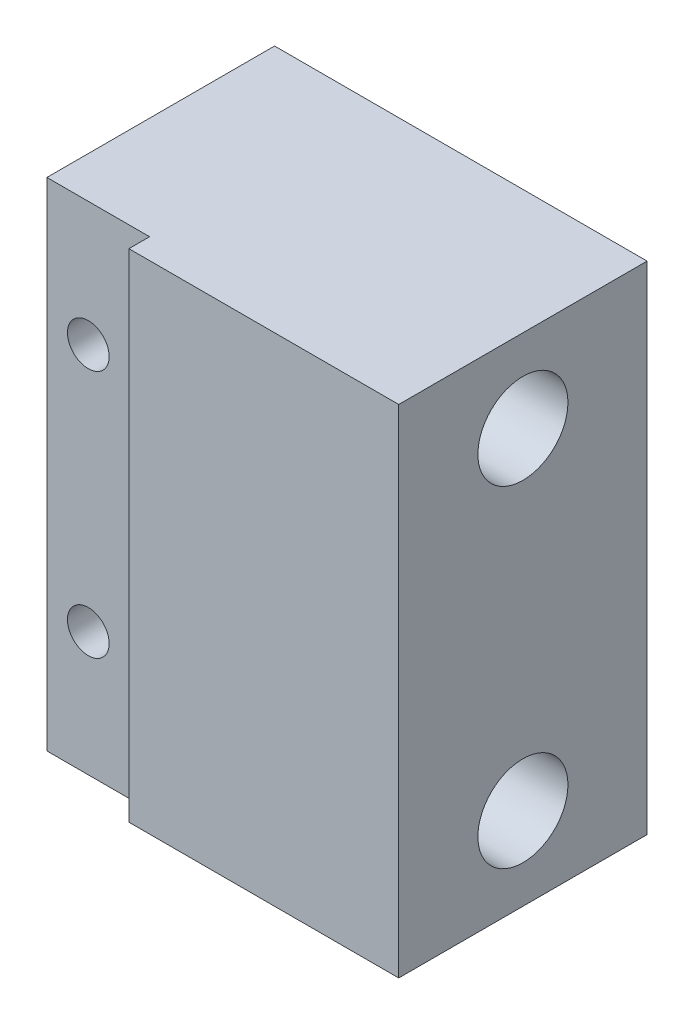
ISO-10303-21;
HEADER;
FILE_DESCRIPTION(('STEP AP214'),'2;1');
FILE_NAME('part.step','',(''),(''),'','','');
FILE_SCHEMA(('AUTOMOTIVE_DESIGN { 1 0 10303 214 1 1 1 1 }'));
ENDSEC;
DATA;
#1=APPLICATION_CONTEXT('core data for automotive mechanical design processes');
#2=APPLICATION_PROTOCOL_DEFINITION('international standard','automotive_design',2000,#1);
#3=PRODUCT_CONTEXT('',#1,'mechanical');
#4=PRODUCT('Part','Part','',(#3));
#5=PRODUCT_RELATED_PRODUCT_CATEGORY('part','',(#4));
#6=PRODUCT_DEFINITION_FORMATION('','',#4);
#7=PRODUCT_DEFINITION_CONTEXT('part definition',#1,'design');
#8=PRODUCT_DEFINITION('design','',#6,#7);
#9=PRODUCT_DEFINITION_SHAPE('','',#8);
#10=(LENGTH_UNIT() NAMED_UNIT(*) SI_UNIT(.MILLI.,.METRE.));
#11=(NAMED_UNIT(*) PLANE_ANGLE_UNIT() SI_UNIT($,.RADIAN.));
#12=(NAMED_UNIT(*) SI_UNIT($,.STERADIAN.) SOLID_ANGLE_UNIT());
#13=UNCERTAINTY_MEASURE_WITH_UNIT(LENGTH_MEASURE(1.E-05),#10,'distance_accuracy_value','');
#14=(GEOMETRIC_REPRESENTATION_CONTEXT(3) GLOBAL_UNCERTAINTY_ASSIGNED_CONTEXT((#13)) GLOBAL_UNIT_ASSIGNED_CONTEXT((#10,
#11,#12)) REPRESENTATION_CONTEXT('',''));
#15=CARTESIAN_POINT('',(0.,0.,0.));
#16=DIRECTION('',(0.,0.,1.));
#17=DIRECTION('',(1.,0.,0.));
#18=AXIS2_PLACEMENT_3D('',#15,#16,#17);
#19=CARTESIAN_POINT('',(-14.2875,-9.525,-4.7625));
#20=DIRECTION('',(0.,0.,-1.));
#21=DIRECTION('',(-1.,0.,0.));
#22=AXIS2_PLACEMENT_3D('',#19,#20,#21);
#23=PLANE('',#22);
#24=CARTESIAN_POINT('',(-12.7,-4.764999995,-4.7625));
#25=DIRECTION('',(0.,0.,1.));
#26=DIRECTION('',(1.,0.,0.));
#27=AXIS2_PLACEMENT_3D('',#24,#25,#26);
#28=CIRCLE('',#27,0.799999999999999);
#29=CARTESIAN_POINT('',(-11.9,-4.764999995,-4.7625));
#30=VERTEX_POINT('',#29);
#31=EDGE_CURVE('E173',#30,#30,#28,.T.);
#32=ORIENTED_EDGE('',*,*,#31,.T.);
#33=EDGE_LOOP('',(#32));
#34=FACE_BOUND('',#33,.T.);
#35=CARTESIAN_POINT('',(-12.7,4.764999995,-4.7625));
#36=DIRECTION('',(0.,0.,1.));
#37=DIRECTION('',(1.,0.,0.));
#38=AXIS2_PLACEMENT_3D('',#35,#36,#37);
#39=CIRCLE('',#38,0.799999999999999);
#40=CARTESIAN_POINT('',(-11.9,4.764999995,-4.7625));
#41=VERTEX_POINT('',#40);
#42=EDGE_CURVE('E176',#41,#41,#39,.T.);
#43=ORIENTED_EDGE('',*,*,#42,.T.);
#44=EDGE_LOOP('',(#43));
#45=FACE_BOUND('',#44,.T.);
#46=DIRECTION('',(0.,1.,0.));
#47=VECTOR('',#46,1.);
#48=CARTESIAN_POINT('',(0.,-9.525,-4.7625));
#49=LINE('',#48,#47);
#50=CARTESIAN_POINT('',(0.,-9.525,-4.7625));
#51=VERTEX_POINT('',#50);
#52=CARTESIAN_POINT('',(0.,9.525,-4.7625));
#53=VERTEX_POINT('',#52);
#54=EDGE_CURVE('E89',#51,#53,#49,.T.);
#55=ORIENTED_EDGE('',*,*,#54,.F.);
#56=DIRECTION('',(1.,0.,0.));
#57=VECTOR('',#56,1.);
#58=CARTESIAN_POINT('',(-14.2875,-9.525,-4.7625));
#59=LINE('',#58,#57);
#60=CARTESIAN_POINT('',(-14.2875,-9.525,-4.7625));
#61=VERTEX_POINT('',#60);
#62=EDGE_CURVE('E11',#61,#51,#59,.T.);
#63=ORIENTED_EDGE('',*,*,#62,.F.);
#64=DIRECTION('',(0.,1.,0.));
#65=VECTOR('',#64,1.);
#66=CARTESIAN_POINT('',(-14.2875,-9.525,-4.7625));
#67=LINE('',#66,#65);
#68=CARTESIAN_POINT('',(-14.2875,9.525,-4.7625));
#69=VERTEX_POINT('',#68);
#70=EDGE_CURVE('E100',#61,#69,#67,.T.);
#71=ORIENTED_EDGE('',*,*,#70,.T.);
#72=DIRECTION('',(1.,0.,0.));
#73=VECTOR('',#72,1.);
#74=CARTESIAN_POINT('',(-14.2875,9.525,-4.7625));
#75=LINE('',#74,#73);
#76=EDGE_CURVE('E42',#69,#53,#75,.T.);
#77=ORIENTED_EDGE('',*,*,#76,.T.);
#78=EDGE_LOOP('',(#55,#63,#71,#77));
#79=FACE_BOUND('',#78,.T.);
#80=ADVANCED_FACE('F39',(#34,#45,#79),#23,.T.);
#81=CARTESIAN_POINT('',(-14.2875,-9.525,4.7625));
#82=DIRECTION('',(0.,-1.,0.));
#83=DIRECTION('',(0.,0.,-1.));
#84=AXIS2_PLACEMENT_3D('',#81,#82,#83);
#85=PLANE('',#84);
#86=DIRECTION('',(-1.,0.,0.));
#87=VECTOR('',#86,1.);
#88=CARTESIAN_POINT('',(-14.2875,-9.525,3.96875));
#89=LINE('',#88,#87);
#90=CARTESIAN_POINT('',(-10.349999874,-9.525,3.96875));
#91=VERTEX_POINT('',#90);
#92=CARTESIAN_POINT('',(-14.2875,-9.525,3.96875));
#93=VERTEX_POINT('',#92);
#94=EDGE_CURVE('E133',#91,#93,#89,.T.);
#95=ORIENTED_EDGE('',*,*,#94,.T.);
#96=DIRECTION('',(0.,0.,-1.));
#97=VECTOR('',#96,1.);
#98=CARTESIAN_POINT('',(-14.2875,-9.525,4.7625));
#99=LINE('',#98,#97);
#100=EDGE_CURVE('E63',#93,#61,#99,.T.);
#101=ORIENTED_EDGE('',*,*,#100,.T.);
#102=ORIENTED_EDGE('',*,*,#62,.T.);
#103=DIRECTION('',(0.,0.,-1.));
#104=VECTOR('',#103,1.);
#105=CARTESIAN_POINT('',(0.,-9.525,4.7625));
#106=LINE('',#105,#104);
#107=CARTESIAN_POINT('',(0.,-9.525,4.7625));
#108=VERTEX_POINT('',#107);
#109=EDGE_CURVE('E84',#108,#51,#106,.T.);
#110=ORIENTED_EDGE('',*,*,#109,.F.);
#111=DIRECTION('',(1.,0.,0.));
#112=VECTOR('',#111,1.);
#113=CARTESIAN_POINT('',(-14.2875,-9.525,4.7625));
#114=LINE('',#113,#112);
#115=CARTESIAN_POINT('',(-10.349999874,-9.525,4.7625));
#116=VERTEX_POINT('',#115);
#117=EDGE_CURVE('E47',#116,#108,#114,.T.);
#118=ORIENTED_EDGE('',*,*,#117,.F.);
#119=DIRECTION('',(0.,0.,-1.));
#120=VECTOR('',#119,1.);
#121=CARTESIAN_POINT('',(-10.349999874,-9.525,4.7625));
#122=LINE('',#121,#120);
#123=EDGE_CURVE('E186',#116,#91,#122,.T.);
#124=ORIENTED_EDGE('',*,*,#123,.T.);
#125=EDGE_LOOP('',(#95,#101,#102,#110,#118,#124));
#126=FACE_BOUND('',#125,.T.);
#127=ADVANCED_FACE('F81',(#126),#85,.T.);
#128=CARTESIAN_POINT('',(-14.2875,-9.525,4.7625));
#129=DIRECTION('',(0.,0.,1.));
#130=DIRECTION('',(1.,0.,0.));
#131=AXIS2_PLACEMENT_3D('',#128,#129,#130);
#132=PLANE('',#131);
#133=DIRECTION('',(0.,1.,0.));
#134=VECTOR('',#133,1.);
#135=CARTESIAN_POINT('',(-10.349999874,-9.525,4.7625));
#136=LINE('',#135,#134);
#137=CARTESIAN_POINT('',(-10.349999874,9.525,4.7625));
#138=VERTEX_POINT('',#137);
#139=EDGE_CURVE('E127',#116,#138,#136,.T.);
#140=ORIENTED_EDGE('',*,*,#139,.F.);
#141=ORIENTED_EDGE('',*,*,#117,.T.);
#142=DIRECTION('',(0.,-1.,0.));
#143=VECTOR('',#142,1.);
#144=CARTESIAN_POINT('',(0.,-9.525,4.7625));
#145=LINE('',#144,#143);
#146=CARTESIAN_POINT('',(0.,9.525,4.7625));
#147=VERTEX_POINT('',#146);
#148=EDGE_CURVE('E99',#147,#108,#145,.T.);
#149=ORIENTED_EDGE('',*,*,#148,.F.);
#150=DIRECTION('',(1.,0.,0.));
#151=VECTOR('',#150,1.);
#152=CARTESIAN_POINT('',(-14.2875,9.525,4.7625));
#153=LINE('',#152,#151);
#154=EDGE_CURVE('E107',#138,#147,#153,.T.);
#155=ORIENTED_EDGE('',*,*,#154,.F.);
#156=EDGE_LOOP('',(#140,#141,#149,#155));
#157=FACE_BOUND('',#156,.T.);
#158=ADVANCED_FACE('F169',(#157),#132,.T.);
#159=CARTESIAN_POINT('',(-14.2875,9.525,4.7625));
#160=DIRECTION('',(0.,1.,0.));
#161=DIRECTION('',(0.,0.,1.));
#162=AXIS2_PLACEMENT_3D('',#159,#160,#161);
#163=PLANE('',#162);
#164=DIRECTION('',(-1.,0.,0.));
#165=VECTOR('',#164,1.);
#166=CARTESIAN_POINT('',(-14.2875,9.525,3.96875));
#167=LINE('',#166,#165);
#168=CARTESIAN_POINT('',(-10.349999874,9.525,3.96875));
#169=VERTEX_POINT('',#168);
#170=CARTESIAN_POINT('',(-14.2875,9.525,3.96875));
#171=VERTEX_POINT('',#170);
#172=EDGE_CURVE('E55',#169,#171,#167,.T.);
#173=ORIENTED_EDGE('',*,*,#172,.F.);
#174=DIRECTION('',(0.,0.,-1.));
#175=VECTOR('',#174,1.);
#176=CARTESIAN_POINT('',(-10.349999874,9.525,4.7625));
#177=LINE('',#176,#175);
#178=EDGE_CURVE('E178',#138,#169,#177,.T.);
#179=ORIENTED_EDGE('',*,*,#178,.F.);
#180=ORIENTED_EDGE('',*,*,#154,.T.);
#181=DIRECTION('',(0.,0.,1.));
#182=VECTOR('',#181,1.);
#183=CARTESIAN_POINT('',(0.,9.525,4.7625));
#184=LINE('',#183,#182);
#185=EDGE_CURVE('E93',#53,#147,#184,.T.);
#186=ORIENTED_EDGE('',*,*,#185,.F.);
#187=ORIENTED_EDGE('',*,*,#76,.F.);
#188=DIRECTION('',(0.,0.,1.));
#189=VECTOR('',#188,1.);
#190=CARTESIAN_POINT('',(-14.2875,9.525,4.7625));
#191=LINE('',#190,#189);
#192=EDGE_CURVE('E102',#69,#171,#191,.T.);
#193=ORIENTED_EDGE('',*,*,#192,.T.);
#194=EDGE_LOOP('',(#173,#179,#180,#186,#187,#193));
#195=FACE_BOUND('',#194,.T.);
#196=ADVANCED_FACE('F114',(#195),#163,.T.);
#197=CARTESIAN_POINT('',(-14.2875,0.,0.));
#198=DIRECTION('',(-1.,0.,0.));
#199=DIRECTION('',(0.,0.,1.));
#200=AXIS2_PLACEMENT_3D('',#197,#198,#199);
#201=PLANE('',#200);
#202=DIRECTION('',(0.,1.,0.));
#203=VECTOR('',#202,1.);
#204=CARTESIAN_POINT('',(-14.2875,-9.525,3.96875));
#205=LINE('',#204,#203);
#206=EDGE_CURVE('E118',#93,#171,#205,.T.);
#207=ORIENTED_EDGE('',*,*,#206,.T.);
#208=ORIENTED_EDGE('',*,*,#192,.F.);
#209=ORIENTED_EDGE('',*,*,#70,.F.);
#210=ORIENTED_EDGE('',*,*,#100,.F.);
#211=EDGE_LOOP('',(#207,#208,#209,#210));
#212=FACE_BOUND('',#211,.T.);
#213=ADVANCED_FACE('F117',(#212),#201,.T.);
#214=CARTESIAN_POINT('',(0.,0.,0.));
#215=DIRECTION('',(-1.,0.,0.));
#216=DIRECTION('',(0.,0.,1.));
#217=AXIS2_PLACEMENT_3D('',#214,#215,#216);
#218=PLANE('',#217);
#219=CARTESIAN_POINT('',(0.,6.35,0.));
#220=DIRECTION('',(1.,0.,0.));
#221=DIRECTION('',(0.,0.,-1.));
#222=AXIS2_PLACEMENT_3D('',#219,#220,#221);
#223=CIRCLE('',#222,1.72719999999999);
#224=CARTESIAN_POINT('',(0.,6.35,-1.72719999999999));
#225=VERTEX_POINT('',#224);
#226=EDGE_CURVE('E121',#225,#225,#223,.T.);
#227=ORIENTED_EDGE('',*,*,#226,.F.);
#228=EDGE_LOOP('',(#227));
#229=FACE_BOUND('',#228,.T.);
#230=CARTESIAN_POINT('',(0.,-6.35,0.));
#231=DIRECTION('',(1.,0.,0.));
#232=DIRECTION('',(0.,0.,-1.));
#233=AXIS2_PLACEMENT_3D('',#230,#231,#232);
#234=CIRCLE('',#233,1.72719999999999);
#235=CARTESIAN_POINT('',(0.,-6.35,-1.72719999999999));
#236=VERTEX_POINT('',#235);
#237=EDGE_CURVE('E137',#236,#236,#234,.T.);
#238=ORIENTED_EDGE('',*,*,#237,.F.);
#239=EDGE_LOOP('',(#238));
#240=FACE_BOUND('',#239,.T.);
#241=ORIENTED_EDGE('',*,*,#54,.T.);
#242=ORIENTED_EDGE('',*,*,#185,.T.);
#243=ORIENTED_EDGE('',*,*,#148,.T.);
#244=ORIENTED_EDGE('',*,*,#109,.T.);
#245=EDGE_LOOP('',(#241,#242,#243,#244));
#246=FACE_BOUND('',#245,.T.);
#247=ADVANCED_FACE('F97',(#229,#240,#246),#218,.F.);
#248=CARTESIAN_POINT('',(-11.43,-6.35,0.));
#249=DIRECTION('',(1.,0.,0.));
#250=DIRECTION('',(0.,0.,-1.));
#251=AXIS2_PLACEMENT_3D('',#248,#249,#250);
#252=CONICAL_SURFACE('',#251,1.7272,1.02974425867665);
#253=CARTESIAN_POINT('',(-12.4678064611844,-6.35,0.));
#254=VERTEX_POINT('',#253);
#255=VERTEX_LOOP('',#254);
#256=FACE_BOUND('',#255,.T.);
#257=CARTESIAN_POINT('',(-11.43,-6.35,0.));
#258=DIRECTION('',(1.,0.,0.));
#259=DIRECTION('',(0.,0.,-1.));
#260=AXIS2_PLACEMENT_3D('',#257,#258,#259);
#261=CIRCLE('',#260,1.7272);
#262=CARTESIAN_POINT('',(-11.43,-6.35,-1.7272));
#263=VERTEX_POINT('',#262);
#264=EDGE_CURVE('E94',#263,#263,#261,.T.);
#265=ORIENTED_EDGE('',*,*,#264,.T.);
#266=EDGE_LOOP('',(#265));
#267=FACE_BOUND('',#266,.T.);
#268=ADVANCED_FACE('F143',(#256,#267),#252,.F.);
#269=CARTESIAN_POINT('',(0.,-6.35,0.));
#270=DIRECTION('',(1.,0.,0.));
#271=DIRECTION('',(0.,0.,-1.));
#272=AXIS2_PLACEMENT_3D('',#269,#270,#271);
#273=CYLINDRICAL_SURFACE('',#272,1.72719999999999);
#274=ORIENTED_EDGE('',*,*,#264,.F.);
#275=EDGE_LOOP('',(#274));
#276=FACE_BOUND('',#275,.T.);
#277=ORIENTED_EDGE('',*,*,#237,.T.);
#278=EDGE_LOOP('',(#277));
#279=FACE_BOUND('',#278,.T.);
#280=ADVANCED_FACE('F145',(#276,#279),#273,.F.);
#281=CARTESIAN_POINT('',(-11.43,6.35,0.));
#282=DIRECTION('',(1.,0.,0.));
#283=DIRECTION('',(0.,0.,-1.));
#284=AXIS2_PLACEMENT_3D('',#281,#282,#283);
#285=CONICAL_SURFACE('',#284,1.7272,1.02974425867665);
#286=CARTESIAN_POINT('',(-12.4678064611844,6.35,0.));
#287=VERTEX_POINT('',#286);
#288=VERTEX_LOOP('',#287);
#289=FACE_BOUND('',#288,.T.);
#290=CARTESIAN_POINT('',(-11.43,6.35,0.));
#291=DIRECTION('',(1.,0.,0.));
#292=DIRECTION('',(0.,0.,-1.));
#293=AXIS2_PLACEMENT_3D('',#290,#291,#292);
#294=CIRCLE('',#293,1.7272);
#295=CARTESIAN_POINT('',(-11.43,6.35,-1.7272));
#296=VERTEX_POINT('',#295);
#297=EDGE_CURVE('E125',#296,#296,#294,.T.);
#298=ORIENTED_EDGE('',*,*,#297,.T.);
#299=EDGE_LOOP('',(#298));
#300=FACE_BOUND('',#299,.T.);
#301=ADVANCED_FACE('F148',(#289,#300),#285,.F.);
#302=CARTESIAN_POINT('',(0.,6.35,0.));
#303=DIRECTION('',(1.,0.,0.));
#304=DIRECTION('',(0.,0.,-1.));
#305=AXIS2_PLACEMENT_3D('',#302,#303,#304);
#306=CYLINDRICAL_SURFACE('',#305,1.72719999999999);
#307=ORIENTED_EDGE('',*,*,#297,.F.);
#308=EDGE_LOOP('',(#307));
#309=FACE_BOUND('',#308,.T.);
#310=ORIENTED_EDGE('',*,*,#226,.T.);
#311=EDGE_LOOP('',(#310));
#312=FACE_BOUND('',#311,.T.);
#313=ADVANCED_FACE('F209',(#309,#312),#306,.F.);
#314=CARTESIAN_POINT('',(-14.2875,-9.525,3.96875));
#315=DIRECTION('',(0.,0.,-1.));
#316=DIRECTION('',(-1.,0.,0.));
#317=AXIS2_PLACEMENT_3D('',#314,#315,#316);
#318=PLANE('',#317);
#319=CARTESIAN_POINT('',(-12.7,-4.764999995,3.96875));
#320=DIRECTION('',(0.,0.,1.));
#321=DIRECTION('',(1.,0.,0.));
#322=AXIS2_PLACEMENT_3D('',#319,#320,#321);
#323=CIRCLE('',#322,0.799999999999999);
#324=CARTESIAN_POINT('',(-11.9,-4.764999995,3.96875));
#325=VERTEX_POINT('',#324);
#326=EDGE_CURVE('E236',#325,#325,#323,.T.);
#327=ORIENTED_EDGE('',*,*,#326,.F.);
#328=EDGE_LOOP('',(#327));
#329=FACE_BOUND('',#328,.T.);
#330=CARTESIAN_POINT('',(-12.7,4.764999995,3.96875));
#331=DIRECTION('',(0.,0.,1.));
#332=DIRECTION('',(1.,0.,0.));
#333=AXIS2_PLACEMENT_3D('',#330,#331,#332);
#334=CIRCLE('',#333,0.799999999999999);
#335=CARTESIAN_POINT('',(-11.9,4.764999995,3.96875));
#336=VERTEX_POINT('',#335);
#337=EDGE_CURVE('E179',#336,#336,#334,.T.);
#338=ORIENTED_EDGE('',*,*,#337,.F.);
#339=EDGE_LOOP('',(#338));
#340=FACE_BOUND('',#339,.T.);
#341=ORIENTED_EDGE('',*,*,#172,.T.);
#342=ORIENTED_EDGE('',*,*,#206,.F.);
#343=ORIENTED_EDGE('',*,*,#94,.F.);
#344=DIRECTION('',(0.,1.,0.));
#345=VECTOR('',#344,1.);
#346=CARTESIAN_POINT('',(-10.349999874,-9.525,3.96875));
#347=LINE('',#346,#345);
#348=EDGE_CURVE('E122',#91,#169,#347,.T.);
#349=ORIENTED_EDGE('',*,*,#348,.T.);
#350=EDGE_LOOP('',(#341,#342,#343,#349));
#351=FACE_BOUND('',#350,.T.);
#352=ADVANCED_FACE('F193',(#329,#340,#351),#318,.F.);
#353=CARTESIAN_POINT('',(-10.349999874,-9.525,4.7625));
#354=DIRECTION('',(1.,0.,0.));
#355=DIRECTION('',(0.,0.,-1.));
#356=AXIS2_PLACEMENT_3D('',#353,#354,#355);
#357=PLANE('',#356);
#358=ORIENTED_EDGE('',*,*,#178,.T.);
#359=ORIENTED_EDGE('',*,*,#348,.F.);
#360=ORIENTED_EDGE('',*,*,#123,.F.);
#361=ORIENTED_EDGE('',*,*,#139,.T.);
#362=EDGE_LOOP('',(#358,#359,#360,#361));
#363=FACE_BOUND('',#362,.T.);
#364=ADVANCED_FACE('F219',(#363),#357,.F.);
#365=CARTESIAN_POINT('',(-12.7,4.764999995,3.96875));
#366=DIRECTION('',(0.,0.,1.));
#367=DIRECTION('',(1.,0.,0.));
#368=AXIS2_PLACEMENT_3D('',#365,#366,#367);
#369=CYLINDRICAL_SURFACE('',#368,0.799999999999999);
#370=ORIENTED_EDGE('',*,*,#42,.F.);
#371=EDGE_LOOP('',(#370));
#372=FACE_BOUND('',#371,.T.);
#373=ORIENTED_EDGE('',*,*,#337,.T.);
#374=EDGE_LOOP('',(#373));
#375=FACE_BOUND('',#374,.T.);
#376=ADVANCED_FACE('F224',(#372,#375),#369,.F.);
#377=CARTESIAN_POINT('',(-12.7,-4.764999995,3.96875));
#378=DIRECTION('',(0.,0.,1.));
#379=DIRECTION('',(1.,0.,0.));
#380=AXIS2_PLACEMENT_3D('',#377,#378,#379);
#381=CYLINDRICAL_SURFACE('',#380,0.799999999999999);
#382=ORIENTED_EDGE('',*,*,#31,.F.);
#383=EDGE_LOOP('',(#382));
#384=FACE_BOUND('',#383,.T.);
#385=ORIENTED_EDGE('',*,*,#326,.T.);
#386=EDGE_LOOP('',(#385));
#387=FACE_BOUND('',#386,.T.);
#388=ADVANCED_FACE('F228',(#384,#387),#381,.F.);
#389=CLOSED_SHELL('',(#80,#127,#158,#196,#213,#247,#268,#280,#301,#313,#352,#364,#376,#388));
#390=MANIFOLD_SOLID_BREP('B2',#389);
#391=ADVANCED_BREP_SHAPE_REPRESENTATION('',(#18,#390),#14);
#392=SHAPE_DEFINITION_REPRESENTATION(#9,#391);
ENDSEC;
END-ISO-10303-21;
